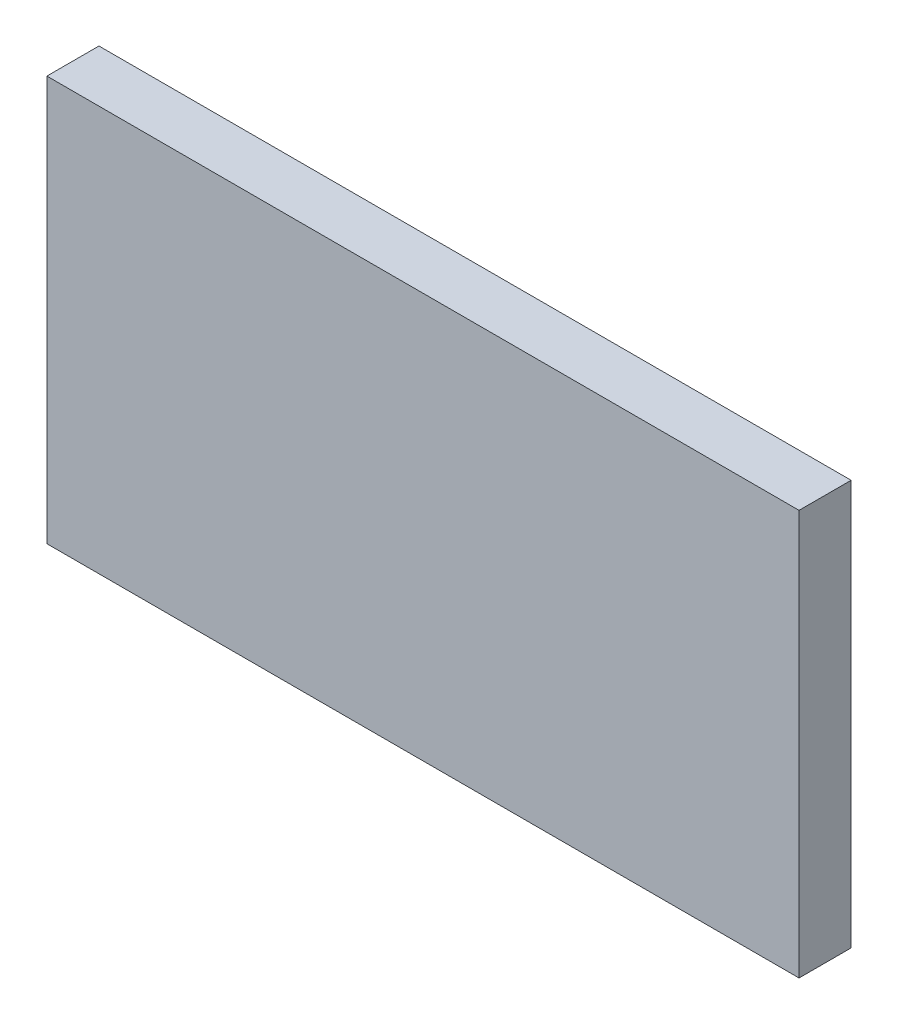
ISO-10303-21;
HEADER;
FILE_DESCRIPTION(('STEP AP214'),'2;1');
FILE_NAME('part.step','',(''),(''),'','','');
FILE_SCHEMA(('AUTOMOTIVE_DESIGN { 1 0 10303 214 1 1 1 1 }'));
ENDSEC;
DATA;
#1=APPLICATION_CONTEXT('core data for automotive mechanical design processes');
#2=APPLICATION_PROTOCOL_DEFINITION('international standard','automotive_design',2000,#1);
#3=PRODUCT_CONTEXT('',#1,'mechanical');
#4=PRODUCT('Part','Part','',(#3));
#5=PRODUCT_RELATED_PRODUCT_CATEGORY('part','',(#4));
#6=PRODUCT_DEFINITION_FORMATION('','',#4);
#7=PRODUCT_DEFINITION_CONTEXT('part definition',#1,'design');
#8=PRODUCT_DEFINITION('design','',#6,#7);
#9=PRODUCT_DEFINITION_SHAPE('','',#8);
#10=(LENGTH_UNIT() NAMED_UNIT(*) SI_UNIT(.MILLI.,.METRE.));
#11=(NAMED_UNIT(*) PLANE_ANGLE_UNIT() SI_UNIT($,.RADIAN.));
#12=(NAMED_UNIT(*) SI_UNIT($,.STERADIAN.) SOLID_ANGLE_UNIT());
#13=UNCERTAINTY_MEASURE_WITH_UNIT(LENGTH_MEASURE(1.E-05),#10,'distance_accuracy_value','');
#14=(GEOMETRIC_REPRESENTATION_CONTEXT(3) GLOBAL_UNCERTAINTY_ASSIGNED_CONTEXT((#13)) GLOBAL_UNIT_ASSIGNED_CONTEXT((#10,
#11,#12)) REPRESENTATION_CONTEXT('',''));
#15=CARTESIAN_POINT('',(0.,0.,0.));
#16=DIRECTION('',(0.,0.,1.));
#17=DIRECTION('',(1.,0.,0.));
#18=AXIS2_PLACEMENT_3D('',#15,#16,#17);
#19=CARTESIAN_POINT('',(-79.3474088291747,71.8714011516315,9.));
#20=DIRECTION('',(1.,0.,0.));
#21=DIRECTION('',(0.,1.,0.));
#22=AXIS2_PLACEMENT_3D('',#19,#20,#21);
#23=PLANE('',#22);
#24=DIRECTION('',(0.,-1.,0.));
#25=VECTOR('',#24,1.);
#26=CARTESIAN_POINT('',(-79.3474088291747,71.8714011516315,0.));
#27=LINE('',#26,#25);
#28=CARTESIAN_POINT('',(-79.3474088291747,71.8714011516315,0.));
#29=VERTEX_POINT('',#28);
#30=CARTESIAN_POINT('',(-79.3474088291747,1.87140115163149,0.));
#31=VERTEX_POINT('',#30);
#32=EDGE_CURVE('E96',#29,#31,#27,.T.);
#33=ORIENTED_EDGE('',*,*,#32,.T.);
#34=DIRECTION('',(0.,0.,-1.));
#35=VECTOR('',#34,1.);
#36=CARTESIAN_POINT('',(-79.3474088291747,1.87140115163149,9.));
#37=LINE('',#36,#35);
#38=CARTESIAN_POINT('',(-79.3474088291747,1.87140115163149,9.));
#39=VERTEX_POINT('',#38);
#40=EDGE_CURVE('E11',#39,#31,#37,.T.);
#41=ORIENTED_EDGE('',*,*,#40,.F.);
#42=DIRECTION('',(0.,-1.,0.));
#43=VECTOR('',#42,1.);
#44=CARTESIAN_POINT('',(-79.3474088291747,71.8714011516315,9.));
#45=LINE('',#44,#43);
#46=CARTESIAN_POINT('',(-79.3474088291747,71.8714011516315,9.));
#47=VERTEX_POINT('',#46);
#48=EDGE_CURVE('E84',#47,#39,#45,.T.);
#49=ORIENTED_EDGE('',*,*,#48,.F.);
#50=DIRECTION('',(0.,0.,-1.));
#51=VECTOR('',#50,1.);
#52=CARTESIAN_POINT('',(-79.3474088291747,71.8714011516315,9.));
#53=LINE('',#52,#51);
#54=EDGE_CURVE('E92',#47,#29,#53,.T.);
#55=ORIENTED_EDGE('',*,*,#54,.T.);
#56=EDGE_LOOP('',(#33,#41,#49,#55));
#57=FACE_BOUND('',#56,.T.);
#58=ADVANCED_FACE('F33',(#57),#23,.F.);
#59=CARTESIAN_POINT('',(-79.3474088291747,1.87140115163149,9.));
#60=DIRECTION('',(0.,1.,0.));
#61=DIRECTION('',(0.,0.,1.));
#62=AXIS2_PLACEMENT_3D('',#59,#60,#61);
#63=PLANE('',#62);
#64=DIRECTION('',(1.,0.,0.));
#65=VECTOR('',#64,1.);
#66=CARTESIAN_POINT('',(-79.3474088291747,1.87140115163149,0.));
#67=LINE('',#66,#65);
#68=CARTESIAN_POINT('',(50.6525911708253,1.87140115163149,0.));
#69=VERTEX_POINT('',#68);
#70=EDGE_CURVE('E88',#31,#69,#67,.T.);
#71=ORIENTED_EDGE('',*,*,#70,.T.);
#72=DIRECTION('',(0.,0.,-1.));
#73=VECTOR('',#72,1.);
#74=CARTESIAN_POINT('',(50.6525911708253,1.87140115163149,9.));
#75=LINE('',#74,#73);
#76=CARTESIAN_POINT('',(50.6525911708253,1.87140115163149,9.));
#77=VERTEX_POINT('',#76);
#78=EDGE_CURVE('E41',#77,#69,#75,.T.);
#79=ORIENTED_EDGE('',*,*,#78,.F.);
#80=DIRECTION('',(1.,0.,0.));
#81=VECTOR('',#80,1.);
#82=CARTESIAN_POINT('',(-79.3474088291747,1.87140115163149,9.));
#83=LINE('',#82,#81);
#84=EDGE_CURVE('E79',#39,#77,#83,.T.);
#85=ORIENTED_EDGE('',*,*,#84,.F.);
#86=ORIENTED_EDGE('',*,*,#40,.T.);
#87=EDGE_LOOP('',(#71,#79,#85,#86));
#88=FACE_BOUND('',#87,.T.);
#89=ADVANCED_FACE('F87',(#88),#63,.F.);
#90=CARTESIAN_POINT('',(50.6525911708253,71.8714011516315,9.));
#91=DIRECTION('',(-1.,0.,0.));
#92=DIRECTION('',(0.,-1.,0.));
#93=AXIS2_PLACEMENT_3D('',#90,#91,#92);
#94=PLANE('',#93);
#95=DIRECTION('',(0.,1.,0.));
#96=VECTOR('',#95,1.);
#97=CARTESIAN_POINT('',(50.6525911708253,71.8714011516315,0.));
#98=LINE('',#97,#96);
#99=CARTESIAN_POINT('',(50.6525911708253,71.8714011516315,0.));
#100=VERTEX_POINT('',#99);
#101=EDGE_CURVE('E66',#69,#100,#98,.T.);
#102=ORIENTED_EDGE('',*,*,#101,.T.);
#103=DIRECTION('',(0.,0.,-1.));
#104=VECTOR('',#103,1.);
#105=CARTESIAN_POINT('',(50.6525911708253,71.8714011516315,9.));
#106=LINE('',#105,#104);
#107=CARTESIAN_POINT('',(50.6525911708253,71.8714011516315,9.));
#108=VERTEX_POINT('',#107);
#109=EDGE_CURVE('E89',#108,#100,#106,.T.);
#110=ORIENTED_EDGE('',*,*,#109,.F.);
#111=DIRECTION('',(0.,1.,0.));
#112=VECTOR('',#111,1.);
#113=CARTESIAN_POINT('',(50.6525911708253,71.8714011516315,9.));
#114=LINE('',#113,#112);
#115=EDGE_CURVE('E82',#77,#108,#114,.T.);
#116=ORIENTED_EDGE('',*,*,#115,.F.);
#117=ORIENTED_EDGE('',*,*,#78,.T.);
#118=EDGE_LOOP('',(#102,#110,#116,#117));
#119=FACE_BOUND('',#118,.T.);
#120=ADVANCED_FACE('F90',(#119),#94,.F.);
#121=CARTESIAN_POINT('',(-79.3474088291747,71.8714011516315,9.));
#122=DIRECTION('',(0.,-1.,0.));
#123=DIRECTION('',(0.,0.,-1.));
#124=AXIS2_PLACEMENT_3D('',#121,#122,#123);
#125=PLANE('',#124);
#126=DIRECTION('',(-1.,0.,0.));
#127=VECTOR('',#126,1.);
#128=CARTESIAN_POINT('',(-79.3474088291747,71.8714011516315,0.));
#129=LINE('',#128,#127);
#130=EDGE_CURVE('E72',#100,#29,#129,.T.);
#131=ORIENTED_EDGE('',*,*,#130,.T.);
#132=ORIENTED_EDGE('',*,*,#54,.F.);
#133=DIRECTION('',(-1.,0.,0.));
#134=VECTOR('',#133,1.);
#135=CARTESIAN_POINT('',(-79.3474088291747,71.8714011516315,9.));
#136=LINE('',#135,#134);
#137=EDGE_CURVE('E49',#108,#47,#136,.T.);
#138=ORIENTED_EDGE('',*,*,#137,.F.);
#139=ORIENTED_EDGE('',*,*,#109,.T.);
#140=EDGE_LOOP('',(#131,#132,#138,#139));
#141=FACE_BOUND('',#140,.T.);
#142=ADVANCED_FACE('F103',(#141),#125,.F.);
#143=CARTESIAN_POINT('',(0.,0.,9.));
#144=DIRECTION('',(0.,0.,1.));
#145=DIRECTION('',(1.,0.,0.));
#146=AXIS2_PLACEMENT_3D('',#143,#144,#145);
#147=PLANE('',#146);
#148=ORIENTED_EDGE('',*,*,#48,.T.);
#149=ORIENTED_EDGE('',*,*,#84,.T.);
#150=ORIENTED_EDGE('',*,*,#115,.T.);
#151=ORIENTED_EDGE('',*,*,#137,.T.);
#152=EDGE_LOOP('',(#148,#149,#150,#151));
#153=FACE_BOUND('',#152,.T.);
#154=ADVANCED_FACE('F80',(#153),#147,.T.);
#155=CARTESIAN_POINT('',(0.,0.,0.));
#156=DIRECTION('',(0.,0.,1.));
#157=DIRECTION('',(1.,0.,0.));
#158=AXIS2_PLACEMENT_3D('',#155,#156,#157);
#159=PLANE('',#158);
#160=ORIENTED_EDGE('',*,*,#32,.F.);
#161=ORIENTED_EDGE('',*,*,#130,.F.);
#162=ORIENTED_EDGE('',*,*,#101,.F.);
#163=ORIENTED_EDGE('',*,*,#70,.F.);
#164=EDGE_LOOP('',(#160,#161,#162,#163));
#165=FACE_BOUND('',#164,.T.);
#166=ADVANCED_FACE('F106',(#165),#159,.F.);
#167=CLOSED_SHELL('',(#58,#89,#120,#142,#154,#166));
#168=MANIFOLD_SOLID_BREP('B2',#167);
#169=ADVANCED_BREP_SHAPE_REPRESENTATION('',(#18,#168),#14);
#170=SHAPE_DEFINITION_REPRESENTATION(#9,#169);
ENDSEC;
END-ISO-10303-21;
